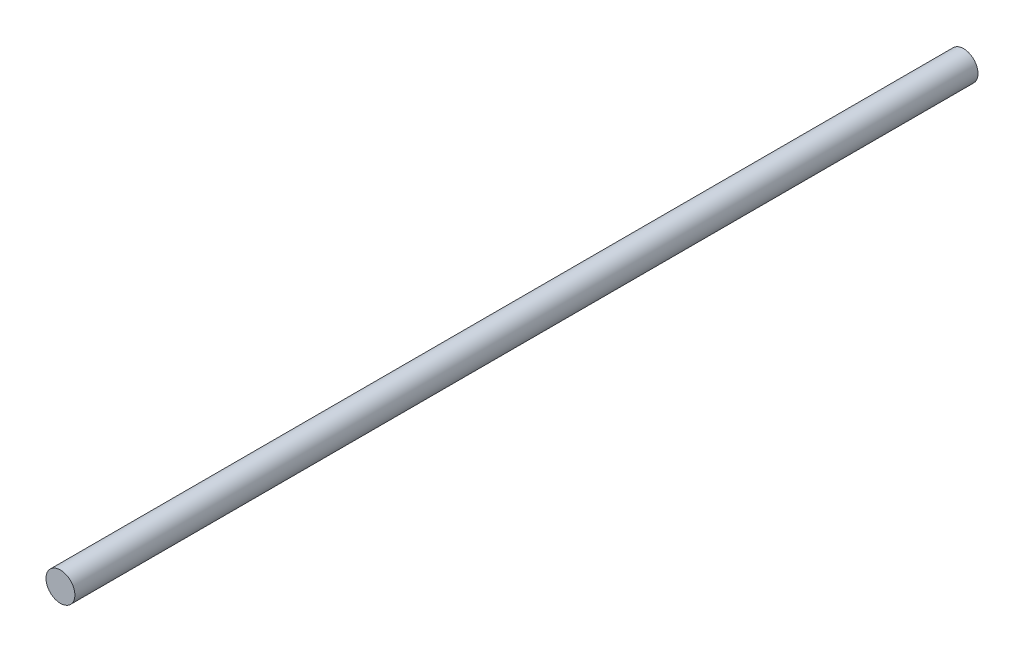
ISO-10303-21;
HEADER;
FILE_DESCRIPTION(('STEP AP214'),'2;1');
FILE_NAME('part.step','',(''),(''),'','','');
FILE_SCHEMA(('AUTOMOTIVE_DESIGN { 1 0 10303 214 1 1 1 1 }'));
ENDSEC;
DATA;
#1=APPLICATION_CONTEXT('core data for automotive mechanical design processes');
#2=APPLICATION_PROTOCOL_DEFINITION('international standard','automotive_design',2000,#1);
#3=PRODUCT_CONTEXT('',#1,'mechanical');
#4=PRODUCT('Part','Part','',(#3));
#5=PRODUCT_RELATED_PRODUCT_CATEGORY('part','',(#4));
#6=PRODUCT_DEFINITION_FORMATION('','',#4);
#7=PRODUCT_DEFINITION_CONTEXT('part definition',#1,'design');
#8=PRODUCT_DEFINITION('design','',#6,#7);
#9=PRODUCT_DEFINITION_SHAPE('','',#8);
#10=(LENGTH_UNIT() NAMED_UNIT(*) SI_UNIT(.MILLI.,.METRE.));
#11=(NAMED_UNIT(*) PLANE_ANGLE_UNIT() SI_UNIT($,.RADIAN.));
#12=(NAMED_UNIT(*) SI_UNIT($,.STERADIAN.) SOLID_ANGLE_UNIT());
#13=UNCERTAINTY_MEASURE_WITH_UNIT(LENGTH_MEASURE(1.E-05),#10,'distance_accuracy_value','');
#14=(GEOMETRIC_REPRESENTATION_CONTEXT(3) GLOBAL_UNCERTAINTY_ASSIGNED_CONTEXT((#13)) GLOBAL_UNIT_ASSIGNED_CONTEXT((#10,
#11,#12)) REPRESENTATION_CONTEXT('',''));
#15=CARTESIAN_POINT('',(0.,0.,0.));
#16=DIRECTION('',(0.,0.,1.));
#17=DIRECTION('',(1.,0.,0.));
#18=AXIS2_PLACEMENT_3D('',#15,#16,#17);
#19=CARTESIAN_POINT('',(0.,0.,500.));
#20=DIRECTION('',(0.,0.,-1.));
#21=DIRECTION('',(-1.,0.,0.));
#22=AXIS2_PLACEMENT_3D('',#19,#20,#21);
#23=CYLINDRICAL_SURFACE('',#22,8.);
#24=CARTESIAN_POINT('',(0.,0.,500.));
#25=DIRECTION('',(0.,0.,1.));
#26=DIRECTION('',(1.,0.,0.));
#27=AXIS2_PLACEMENT_3D('',#24,#25,#26);
#28=CIRCLE('',#27,8.);
#29=CARTESIAN_POINT('',(8.,0.,500.));
#30=VERTEX_POINT('',#29);
#31=EDGE_CURVE('E10',#30,#30,#28,.T.);
#32=ORIENTED_EDGE('',*,*,#31,.F.);
#33=EDGE_LOOP('',(#32));
#34=FACE_BOUND('',#33,.T.);
#35=CARTESIAN_POINT('',(0.,0.,0.));
#36=DIRECTION('',(0.,0.,1.));
#37=DIRECTION('',(1.,0.,0.));
#38=AXIS2_PLACEMENT_3D('',#35,#36,#37);
#39=CIRCLE('',#38,8.);
#40=CARTESIAN_POINT('',(8.,0.,0.));
#41=VERTEX_POINT('',#40);
#42=EDGE_CURVE('E34',#41,#41,#39,.T.);
#43=ORIENTED_EDGE('',*,*,#42,.T.);
#44=EDGE_LOOP('',(#43));
#45=FACE_BOUND('',#44,.T.);
#46=ADVANCED_FACE('F31',(#34,#45),#23,.T.);
#47=CARTESIAN_POINT('',(0.,0.,500.));
#48=DIRECTION('',(0.,0.,1.));
#49=DIRECTION('',(1.,0.,0.));
#50=AXIS2_PLACEMENT_3D('',#47,#48,#49);
#51=PLANE('',#50);
#52=ORIENTED_EDGE('',*,*,#31,.T.);
#53=EDGE_LOOP('',(#52));
#54=FACE_BOUND('',#53,.T.);
#55=ADVANCED_FACE('F46',(#54),#51,.T.);
#56=CARTESIAN_POINT('',(0.,0.,0.));
#57=DIRECTION('',(0.,0.,1.));
#58=DIRECTION('',(1.,0.,0.));
#59=AXIS2_PLACEMENT_3D('',#56,#57,#58);
#60=PLANE('',#59);
#61=ORIENTED_EDGE('',*,*,#42,.F.);
#62=EDGE_LOOP('',(#61));
#63=FACE_BOUND('',#62,.T.);
#64=ADVANCED_FACE('F44',(#63),#60,.F.);
#65=CLOSED_SHELL('',(#46,#55,#64));
#66=MANIFOLD_SOLID_BREP('B2',#65);
#67=ADVANCED_BREP_SHAPE_REPRESENTATION('',(#18,#66),#14);
#68=SHAPE_DEFINITION_REPRESENTATION(#9,#67);
ENDSEC;
END-ISO-10303-21;
